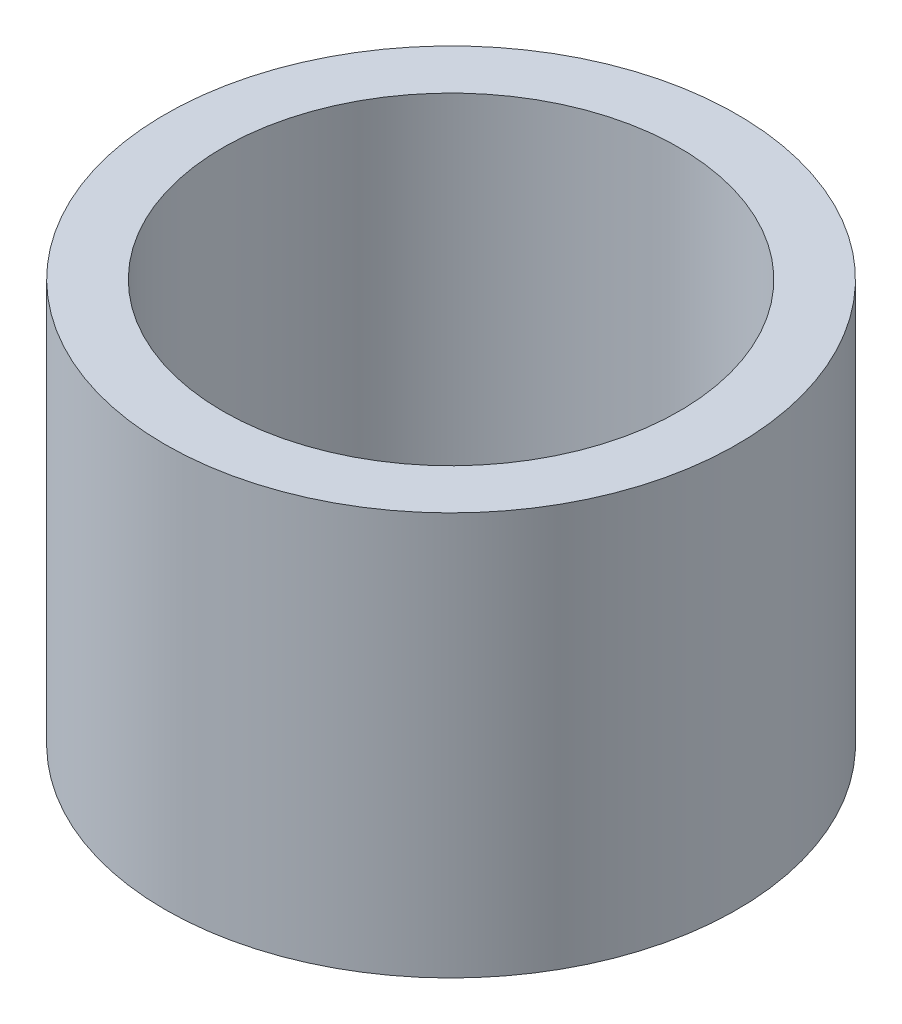
ISO-10303-21;
HEADER;
FILE_DESCRIPTION(('STEP AP214'),'2;1');
FILE_NAME('part.step','',(''),(''),'','','');
FILE_SCHEMA(('AUTOMOTIVE_DESIGN { 1 0 10303 214 1 1 1 1 }'));
ENDSEC;
DATA;
#1=APPLICATION_CONTEXT('core data for automotive mechanical design processes');
#2=APPLICATION_PROTOCOL_DEFINITION('international standard','automotive_design',2000,#1);
#3=PRODUCT_CONTEXT('',#1,'mechanical');
#4=PRODUCT('Part','Part','',(#3));
#5=PRODUCT_RELATED_PRODUCT_CATEGORY('part','',(#4));
#6=PRODUCT_DEFINITION_FORMATION('','',#4);
#7=PRODUCT_DEFINITION_CONTEXT('part definition',#1,'design');
#8=PRODUCT_DEFINITION('design','',#6,#7);
#9=PRODUCT_DEFINITION_SHAPE('','',#8);
#10=(LENGTH_UNIT() NAMED_UNIT(*) SI_UNIT(.MILLI.,.METRE.));
#11=(NAMED_UNIT(*) PLANE_ANGLE_UNIT() SI_UNIT($,.RADIAN.));
#12=(NAMED_UNIT(*) SI_UNIT($,.STERADIAN.) SOLID_ANGLE_UNIT());
#13=UNCERTAINTY_MEASURE_WITH_UNIT(LENGTH_MEASURE(1.E-05),#10,'distance_accuracy_value','');
#14=(GEOMETRIC_REPRESENTATION_CONTEXT(3) GLOBAL_UNCERTAINTY_ASSIGNED_CONTEXT((#13)) GLOBAL_UNIT_ASSIGNED_CONTEXT((#10,
#11,#12)) REPRESENTATION_CONTEXT('',''));
#15=CARTESIAN_POINT('',(0.,0.,0.));
#16=DIRECTION('',(0.,0.,1.));
#17=DIRECTION('',(1.,0.,0.));
#18=AXIS2_PLACEMENT_3D('',#15,#16,#17);
#19=CARTESIAN_POINT('',(0.,-76.2,0.));
#20=DIRECTION('',(0.,1.,0.));
#21=DIRECTION('',(0.,0.,1.));
#22=AXIS2_PLACEMENT_3D('',#19,#20,#21);
#23=CYLINDRICAL_SURFACE('',#22,54.102);
#24=CARTESIAN_POINT('',(0.,-76.2,0.));
#25=DIRECTION('',(0.,1.,0.));
#26=DIRECTION('',(0.,0.,1.));
#27=AXIS2_PLACEMENT_3D('',#24,#25,#26);
#28=CIRCLE('',#27,54.102);
#29=CARTESIAN_POINT('',(0.,-76.2,54.102));
#30=VERTEX_POINT('',#29);
#31=EDGE_CURVE('E10',#30,#30,#28,.T.);
#32=CARTESIAN_POINT('',(0.,0.,0.));
#33=DIRECTION('',(0.,1.,0.));
#34=DIRECTION('',(0.,0.,1.));
#35=AXIS2_PLACEMENT_3D('',#32,#33,#34);
#36=CIRCLE('',#35,54.102);
#37=CARTESIAN_POINT('',(0.,0.,54.102));
#38=VERTEX_POINT('',#37);
#39=EDGE_CURVE('E38',#38,#38,#36,.T.);
#40=CARTESIAN_POINT('',(0.,-76.2,54.102));
#41=CARTESIAN_POINT('',(0.,-75.40625,54.102));
#42=CARTESIAN_POINT('',(0.,-74.6125,54.102));
#43=CARTESIAN_POINT('',(0.,-73.025,54.102));
#44=CARTESIAN_POINT('',(0.,-72.23125,54.102));
#45=CARTESIAN_POINT('',(0.,-70.64375,54.102));
#46=CARTESIAN_POINT('',(0.,-69.85,54.102));
#47=CARTESIAN_POINT('',(0.,-68.2625,54.102));
#48=CARTESIAN_POINT('',(0.,-67.46875,54.102));
#49=CARTESIAN_POINT('',(0.,-65.88125,54.102));
#50=CARTESIAN_POINT('',(0.,-65.0875,54.102));
#51=CARTESIAN_POINT('',(0.,-63.5,54.102));
#52=CARTESIAN_POINT('',(0.,-62.70625,54.102));
#53=CARTESIAN_POINT('',(0.,-61.11875,54.102));
#54=CARTESIAN_POINT('',(0.,-60.325,54.102));
#55=CARTESIAN_POINT('',(0.,-58.7375,54.102));
#56=CARTESIAN_POINT('',(0.,-57.94375,54.102));
#57=CARTESIAN_POINT('',(0.,-56.35625,54.102));
#58=CARTESIAN_POINT('',(0.,-55.5625,54.102));
#59=CARTESIAN_POINT('',(0.,-53.975,54.102));
#60=CARTESIAN_POINT('',(0.,-53.18125,54.102));
#61=CARTESIAN_POINT('',(0.,-51.59375,54.102));
#62=CARTESIAN_POINT('',(0.,-50.8,54.102));
#63=CARTESIAN_POINT('',(0.,-49.2125,54.102));
#64=CARTESIAN_POINT('',(0.,-48.41875,54.102));
#65=CARTESIAN_POINT('',(0.,-46.83125,54.102));
#66=CARTESIAN_POINT('',(0.,-46.0375,54.102));
#67=CARTESIAN_POINT('',(0.,-44.45,54.102));
#68=CARTESIAN_POINT('',(0.,-43.65625,54.102));
#69=CARTESIAN_POINT('',(0.,-42.06875,54.102));
#70=CARTESIAN_POINT('',(0.,-41.275,54.102));
#71=CARTESIAN_POINT('',(0.,-39.6875,54.102));
#72=CARTESIAN_POINT('',(0.,-38.89375,54.102));
#73=CARTESIAN_POINT('',(0.,-37.30625,54.102));
#74=CARTESIAN_POINT('',(0.,-36.5125,54.102));
#75=CARTESIAN_POINT('',(0.,-34.925,54.102));
#76=CARTESIAN_POINT('',(0.,-34.13125,54.102));
#77=CARTESIAN_POINT('',(0.,-32.54375,54.102));
#78=CARTESIAN_POINT('',(0.,-31.75,54.102));
#79=CARTESIAN_POINT('',(0.,-30.1625,54.102));
#80=CARTESIAN_POINT('',(0.,-29.36875,54.102));
#81=CARTESIAN_POINT('',(0.,-27.78125,54.102));
#82=CARTESIAN_POINT('',(0.,-26.9875,54.102));
#83=CARTESIAN_POINT('',(0.,-25.4,54.102));
#84=CARTESIAN_POINT('',(0.,-24.60625,54.102));
#85=CARTESIAN_POINT('',(0.,-23.01875,54.102));
#86=CARTESIAN_POINT('',(0.,-22.225,54.102));
#87=CARTESIAN_POINT('',(0.,-20.6375,54.102));
#88=CARTESIAN_POINT('',(0.,-19.84375,54.102));
#89=CARTESIAN_POINT('',(0.,-18.25625,54.102));
#90=CARTESIAN_POINT('',(0.,-17.4625,54.102));
#91=CARTESIAN_POINT('',(0.,-15.875,54.102));
#92=CARTESIAN_POINT('',(0.,-15.08125,54.102));
#93=CARTESIAN_POINT('',(0.,-13.49375,54.102));
#94=CARTESIAN_POINT('',(0.,-12.7,54.102));
#95=CARTESIAN_POINT('',(0.,-11.1125,54.102));
#96=CARTESIAN_POINT('',(0.,-10.31875,54.102));
#97=CARTESIAN_POINT('',(0.,-8.73125,54.102));
#98=CARTESIAN_POINT('',(0.,-7.93750000000001,54.102));
#99=CARTESIAN_POINT('',(0.,-6.35,54.102));
#100=CARTESIAN_POINT('',(0.,-5.55625,54.102));
#101=CARTESIAN_POINT('',(0.,-3.96875,54.102));
#102=CARTESIAN_POINT('',(0.,-3.175,54.102));
#103=CARTESIAN_POINT('',(0.,-1.5875,54.102));
#104=CARTESIAN_POINT('',(0.,-0.793750000000001,54.102));
#105=CARTESIAN_POINT('',(0.,0.,54.102));
#106=B_SPLINE_CURVE_WITH_KNOTS('',3,(#40,#41,#42,#43,#44,#45,#46,#47,#48,#49,#50,#51,#52,#53,
#54,#55,#56,#57,#58,#59,#60,#61,#62,#63,#64,#65,#66,#67,#68,#69,#70,#71,#72,#73,#74,#75,#76,#77,
#78,#79,#80,#81,#82,#83,#84,#85,#86,#87,#88,#89,#90,#91,#92,#93,#94,#95,#96,#97,#98,#99,#100,
#101,#102,#103,#104,#105),.UNSPECIFIED.,.F.,.F.,(4,2,2,2,2,2,2,2,2,2,2,2,2,2,2,2,2,2,2,2,2,2,2,
2,2,2,2,2,2,2,2,2,4),(0.,2.38125,4.7625,7.14375,9.52500000000001,11.90625,14.2875,16.66875,
19.05,21.43125,23.8125,26.19375,28.575,30.95625,33.3375,35.71875,38.1,40.48125,42.8625,45.24375,
47.625,50.00625,52.3875,54.76875,57.15,59.53125,61.9125,64.29375,66.675,69.05625,71.4375,
73.81875,76.2),.UNSPECIFIED.);
#107=EDGE_CURVE('BSEAM35',#30,#38,#106,.T.);
#108=ORIENTED_EDGE('',*,*,#31,.T.);
#109=ORIENTED_EDGE('',*,*,#39,.F.);
#110=ORIENTED_EDGE('',*,*,#107,.T.);
#111=ORIENTED_EDGE('',*,*,#107,.F.);
#112=EDGE_LOOP('',(#108,#110,#109,#111));
#113=FACE_BOUND('',#112,.T.);
#114=ADVANCED_FACE('F35',(#113),#23,.T.);
#115=CARTESIAN_POINT('',(0.,-76.2,0.));
#116=DIRECTION('',(0.,1.,0.));
#117=DIRECTION('',(0.,0.,1.));
#118=AXIS2_PLACEMENT_3D('',#115,#116,#117);
#119=PLANE('',#118);
#120=CARTESIAN_POINT('',(0.,-76.2,0.));
#121=DIRECTION('',(0.,1.,0.));
#122=DIRECTION('',(0.,0.,1.));
#123=AXIS2_PLACEMENT_3D('',#120,#121,#122);
#124=CIRCLE('',#123,43.18);
#125=CARTESIAN_POINT('',(0.,-76.2,43.18));
#126=VERTEX_POINT('',#125);
#127=EDGE_CURVE('E45',#126,#126,#124,.T.);
#128=ORIENTED_EDGE('',*,*,#127,.T.);
#129=EDGE_LOOP('',(#128));
#130=FACE_BOUND('',#129,.T.);
#131=ORIENTED_EDGE('',*,*,#31,.F.);
#132=EDGE_LOOP('',(#131));
#133=FACE_BOUND('',#132,.T.);
#134=ADVANCED_FACE('F53',(#130,#133),#119,.F.);
#135=CARTESIAN_POINT('',(0.,0.,0.));
#136=DIRECTION('',(0.,1.,0.));
#137=DIRECTION('',(0.,0.,1.));
#138=AXIS2_PLACEMENT_3D('',#135,#136,#137);
#139=PLANE('',#138);
#140=CARTESIAN_POINT('',(0.,0.,0.));
#141=DIRECTION('',(0.,1.,0.));
#142=DIRECTION('',(0.,0.,1.));
#143=AXIS2_PLACEMENT_3D('',#140,#141,#142);
#144=CIRCLE('',#143,43.18);
#145=CARTESIAN_POINT('',(0.,0.,43.18));
#146=VERTEX_POINT('',#145);
#147=EDGE_CURVE('E47',#146,#146,#144,.T.);
#148=ORIENTED_EDGE('',*,*,#147,.F.);
#149=EDGE_LOOP('',(#148));
#150=FACE_BOUND('',#149,.T.);
#151=ORIENTED_EDGE('',*,*,#39,.T.);
#152=EDGE_LOOP('',(#151));
#153=FACE_BOUND('',#152,.T.);
#154=ADVANCED_FACE('F59',(#150,#153),#139,.T.);
#155=CARTESIAN_POINT('',(0.,-76.2,0.));
#156=DIRECTION('',(0.,1.,0.));
#157=DIRECTION('',(0.,0.,1.));
#158=AXIS2_PLACEMENT_3D('',#155,#156,#157);
#159=CYLINDRICAL_SURFACE('',#158,43.18);
#160=CARTESIAN_POINT('',(0.,-76.2,43.18));
#161=CARTESIAN_POINT('',(0.,-75.40625,43.18));
#162=CARTESIAN_POINT('',(0.,-74.6125,43.18));
#163=CARTESIAN_POINT('',(0.,-73.025,43.18));
#164=CARTESIAN_POINT('',(0.,-72.23125,43.18));
#165=CARTESIAN_POINT('',(0.,-70.64375,43.18));
#166=CARTESIAN_POINT('',(0.,-69.85,43.18));
#167=CARTESIAN_POINT('',(0.,-68.2625,43.18));
#168=CARTESIAN_POINT('',(0.,-67.46875,43.18));
#169=CARTESIAN_POINT('',(0.,-65.88125,43.18));
#170=CARTESIAN_POINT('',(0.,-65.0875,43.18));
#171=CARTESIAN_POINT('',(0.,-63.5,43.18));
#172=CARTESIAN_POINT('',(0.,-62.70625,43.18));
#173=CARTESIAN_POINT('',(0.,-61.11875,43.18));
#174=CARTESIAN_POINT('',(0.,-60.325,43.18));
#175=CARTESIAN_POINT('',(0.,-58.7375,43.18));
#176=CARTESIAN_POINT('',(0.,-57.94375,43.18));
#177=CARTESIAN_POINT('',(0.,-56.35625,43.18));
#178=CARTESIAN_POINT('',(0.,-55.5625,43.18));
#179=CARTESIAN_POINT('',(0.,-53.975,43.18));
#180=CARTESIAN_POINT('',(0.,-53.18125,43.18));
#181=CARTESIAN_POINT('',(0.,-51.59375,43.18));
#182=CARTESIAN_POINT('',(0.,-50.8,43.18));
#183=CARTESIAN_POINT('',(0.,-49.2125,43.18));
#184=CARTESIAN_POINT('',(0.,-48.41875,43.18));
#185=CARTESIAN_POINT('',(0.,-46.83125,43.18));
#186=CARTESIAN_POINT('',(0.,-46.0375,43.18));
#187=CARTESIAN_POINT('',(0.,-44.45,43.18));
#188=CARTESIAN_POINT('',(0.,-43.65625,43.18));
#189=CARTESIAN_POINT('',(0.,-42.06875,43.18));
#190=CARTESIAN_POINT('',(0.,-41.275,43.18));
#191=CARTESIAN_POINT('',(0.,-39.6875,43.18));
#192=CARTESIAN_POINT('',(0.,-38.89375,43.18));
#193=CARTESIAN_POINT('',(0.,-37.30625,43.18));
#194=CARTESIAN_POINT('',(0.,-36.5125,43.18));
#195=CARTESIAN_POINT('',(0.,-34.925,43.18));
#196=CARTESIAN_POINT('',(0.,-34.13125,43.18));
#197=CARTESIAN_POINT('',(0.,-32.54375,43.18));
#198=CARTESIAN_POINT('',(0.,-31.75,43.18));
#199=CARTESIAN_POINT('',(0.,-30.1625,43.18));
#200=CARTESIAN_POINT('',(0.,-29.36875,43.18));
#201=CARTESIAN_POINT('',(0.,-27.78125,43.18));
#202=CARTESIAN_POINT('',(0.,-26.9875,43.18));
#203=CARTESIAN_POINT('',(0.,-25.4,43.18));
#204=CARTESIAN_POINT('',(0.,-24.60625,43.18));
#205=CARTESIAN_POINT('',(0.,-23.01875,43.18));
#206=CARTESIAN_POINT('',(0.,-22.225,43.18));
#207=CARTESIAN_POINT('',(0.,-20.6375,43.18));
#208=CARTESIAN_POINT('',(0.,-19.84375,43.18));
#209=CARTESIAN_POINT('',(0.,-18.25625,43.18));
#210=CARTESIAN_POINT('',(0.,-17.4625,43.18));
#211=CARTESIAN_POINT('',(0.,-15.875,43.18));
#212=CARTESIAN_POINT('',(0.,-15.08125,43.18));
#213=CARTESIAN_POINT('',(0.,-13.49375,43.18));
#214=CARTESIAN_POINT('',(0.,-12.7,43.18));
#215=CARTESIAN_POINT('',(0.,-11.1125,43.18));
#216=CARTESIAN_POINT('',(0.,-10.31875,43.18));
#217=CARTESIAN_POINT('',(0.,-8.73125,43.18));
#218=CARTESIAN_POINT('',(0.,-7.93750000000001,43.18));
#219=CARTESIAN_POINT('',(0.,-6.35,43.18));
#220=CARTESIAN_POINT('',(0.,-5.55625,43.18));
#221=CARTESIAN_POINT('',(0.,-3.96875,43.18));
#222=CARTESIAN_POINT('',(0.,-3.175,43.18));
#223=CARTESIAN_POINT('',(0.,-1.5875,43.18));
#224=CARTESIAN_POINT('',(0.,-0.793750000000001,43.18));
#225=CARTESIAN_POINT('',(0.,0.,43.18));
#226=B_SPLINE_CURVE_WITH_KNOTS('',3,(#160,#161,#162,#163,#164,#165,#166,#167,#168,#169,#170,
#171,#172,#173,#174,#175,#176,#177,#178,#179,#180,#181,#182,#183,#184,#185,#186,#187,#188,#189,
#190,#191,#192,#193,#194,#195,#196,#197,#198,#199,#200,#201,#202,#203,#204,#205,#206,#207,#208,
#209,#210,#211,#212,#213,#214,#215,#216,#217,#218,#219,#220,#221,#222,#223,#224,#225),
.UNSPECIFIED.,.F.,.F.,(4,2,2,2,2,2,2,2,2,2,2,2,2,2,2,2,2,2,2,2,2,2,2,2,2,2,2,2,2,2,2,2,4),(0.,
2.38124999999999,4.76249999999999,7.14374999999999,9.52499999999999,11.90625,14.2875,16.66875,
19.05,21.43125,23.8125,26.19375,28.575,30.95625,33.3375,35.71875,38.1,40.48125,42.8625,45.24375,
47.625,50.00625,52.3875,54.76875,57.15,59.53125,61.9125,64.29375,66.675,69.05625,71.4375,
73.81875,76.2),.UNSPECIFIED.);
#227=EDGE_CURVE('BSEAM56',#126,#146,#226,.T.);
#228=ORIENTED_EDGE('',*,*,#127,.F.);
#229=ORIENTED_EDGE('',*,*,#147,.T.);
#230=ORIENTED_EDGE('',*,*,#227,.T.);
#231=ORIENTED_EDGE('',*,*,#227,.F.);
#232=EDGE_LOOP('',(#228,#230,#229,#231));
#233=FACE_BOUND('',#232,.T.);
#234=ADVANCED_FACE('F56',(#233),#159,.F.);
#235=CLOSED_SHELL('',(#114,#134,#154,#234));
#236=MANIFOLD_SOLID_BREP('B2',#235);
#237=ADVANCED_BREP_SHAPE_REPRESENTATION('',(#18,#236),#14);
#238=SHAPE_DEFINITION_REPRESENTATION(#9,#237);
ENDSEC;
END-ISO-10303-21;
